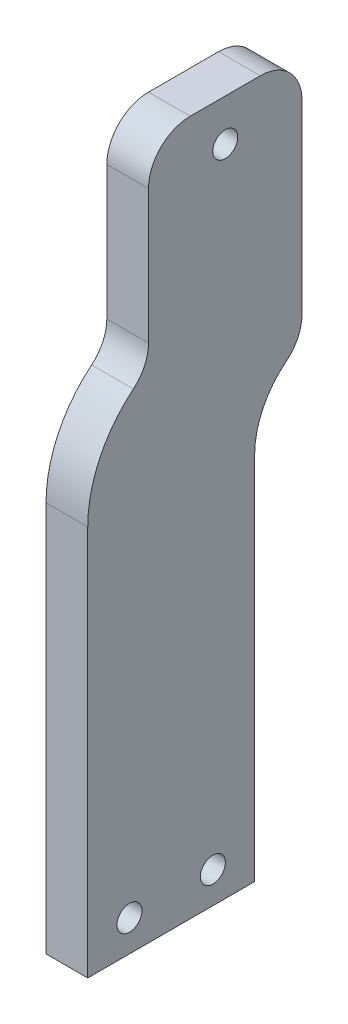
ISO-10303-21;
HEADER;
FILE_DESCRIPTION(('STEP AP214'),'2;1');
FILE_NAME('part.step','',(''),(''),'','','');
FILE_SCHEMA(('AUTOMOTIVE_DESIGN { 1 0 10303 214 1 1 1 1 }'));
ENDSEC;
DATA;
#1=APPLICATION_CONTEXT('core data for automotive mechanical design processes');
#2=APPLICATION_PROTOCOL_DEFINITION('international standard','automotive_design',2000,#1);
#3=PRODUCT_CONTEXT('',#1,'mechanical');
#4=PRODUCT('Part','Part','',(#3));
#5=PRODUCT_RELATED_PRODUCT_CATEGORY('part','',(#4));
#6=PRODUCT_DEFINITION_FORMATION('','',#4);
#7=PRODUCT_DEFINITION_CONTEXT('part definition',#1,'design');
#8=PRODUCT_DEFINITION('design','',#6,#7);
#9=PRODUCT_DEFINITION_SHAPE('','',#8);
#10=(LENGTH_UNIT() NAMED_UNIT(*) SI_UNIT(.MILLI.,.METRE.));
#11=(NAMED_UNIT(*) PLANE_ANGLE_UNIT() SI_UNIT($,.RADIAN.));
#12=(NAMED_UNIT(*) SI_UNIT($,.STERADIAN.) SOLID_ANGLE_UNIT());
#13=UNCERTAINTY_MEASURE_WITH_UNIT(LENGTH_MEASURE(1.E-05),#10,'distance_accuracy_value','');
#14=(GEOMETRIC_REPRESENTATION_CONTEXT(3) GLOBAL_UNCERTAINTY_ASSIGNED_CONTEXT((#13)) GLOBAL_UNIT_ASSIGNED_CONTEXT((#10,
#11,#12)) REPRESENTATION_CONTEXT('',''));
#15=CARTESIAN_POINT('',(0.,0.,0.));
#16=DIRECTION('',(0.,0.,1.));
#17=DIRECTION('',(1.,0.,0.));
#18=AXIS2_PLACEMENT_3D('',#15,#16,#17);
#19=CARTESIAN_POINT('',(10.,58.3956146638437,-40.0000999096368));
#20=DIRECTION('',(-1.,0.,0.));
#21=DIRECTION('',(0.,0.,1.));
#22=AXIS2_PLACEMENT_3D('',#19,#20,#21);
#23=CYLINDRICAL_SURFACE('',#22,20.);
#24=CARTESIAN_POINT('',(0.,58.3956146638437,-40.0000999096368));
#25=DIRECTION('',(-1.,0.,0.));
#26=DIRECTION('',(0.,0.,1.));
#27=AXIS2_PLACEMENT_3D('',#24,#25,#26);
#28=CIRCLE('',#27,20.);
#29=CARTESIAN_POINT('',(0.,58.3956146638437,-20.0000999096368));
#30=VERTEX_POINT('',#29);
#31=CARTESIAN_POINT('',(0.,74.0632893384125,-27.5693328258292));
#32=VERTEX_POINT('',#31);
#33=EDGE_CURVE('E151',#30,#32,#28,.T.);
#34=ORIENTED_EDGE('',*,*,#33,.T.);
#35=DIRECTION('',(-1.,0.,0.));
#36=VECTOR('',#35,1.);
#37=CARTESIAN_POINT('',(10.,74.0632893384125,-27.5693328258292));
#38=LINE('',#37,#36);
#39=CARTESIAN_POINT('',(10.,74.0632893384125,-27.5693328258292));
#40=VERTEX_POINT('',#39);
#41=EDGE_CURVE('E11',#40,#32,#38,.T.);
#42=ORIENTED_EDGE('',*,*,#41,.F.);
#43=CARTESIAN_POINT('',(10.,58.3956146638437,-40.0000999096368));
#44=DIRECTION('',(-1.,0.,0.));
#45=DIRECTION('',(0.,0.,1.));
#46=AXIS2_PLACEMENT_3D('',#43,#44,#45);
#47=CIRCLE('',#46,20.);
#48=CARTESIAN_POINT('',(10.,58.3956146638437,-20.0000999096368));
#49=VERTEX_POINT('',#48);
#50=EDGE_CURVE('E174',#49,#40,#47,.T.);
#51=ORIENTED_EDGE('',*,*,#50,.F.);
#52=DIRECTION('',(-1.,0.,0.));
#53=VECTOR('',#52,1.);
#54=CARTESIAN_POINT('',(10.,58.3956146638437,-20.0000999096368));
#55=LINE('',#54,#53);
#56=EDGE_CURVE('E147',#49,#30,#55,.T.);
#57=ORIENTED_EDGE('',*,*,#56,.T.);
#58=EDGE_LOOP('',(#34,#42,#51,#57));
#59=FACE_BOUND('',#58,.T.);
#60=ADVANCED_FACE('F31',(#59),#23,.F.);
#61=CARTESIAN_POINT('',(10.,81.8971266756969,-21.3539492839254));
#62=DIRECTION('',(-1.,0.,0.));
#63=DIRECTION('',(0.,0.,1.));
#64=AXIS2_PLACEMENT_3D('',#61,#62,#63);
#65=CYLINDRICAL_SURFACE('',#64,10.);
#66=CARTESIAN_POINT('',(0.,81.8971266756969,-21.3539492839254));
#67=DIRECTION('',(1.,0.,0.));
#68=DIRECTION('',(0.,0.,-1.));
#69=AXIS2_PLACEMENT_3D('',#66,#67,#68);
#70=CIRCLE('',#69,10.);
#71=CARTESIAN_POINT('',(0.,81.8971266756969,-31.3539492839254));
#72=VERTEX_POINT('',#71);
#73=EDGE_CURVE('E154',#32,#72,#70,.T.);
#74=ORIENTED_EDGE('',*,*,#73,.T.);
#75=DIRECTION('',(-1.,0.,0.));
#76=VECTOR('',#75,1.);
#77=CARTESIAN_POINT('',(10.,81.8971266756969,-31.3539492839254));
#78=LINE('',#77,#76);
#79=CARTESIAN_POINT('',(10.,81.8971266756969,-31.3539492839254));
#80=VERTEX_POINT('',#79);
#81=EDGE_CURVE('E39',#80,#72,#78,.T.);
#82=ORIENTED_EDGE('',*,*,#81,.F.);
#83=CARTESIAN_POINT('',(10.,81.8971266756969,-21.3539492839254));
#84=DIRECTION('',(1.,0.,0.));
#85=DIRECTION('',(0.,0.,-1.));
#86=AXIS2_PLACEMENT_3D('',#83,#84,#85);
#87=CIRCLE('',#86,10.);
#88=EDGE_CURVE('E102',#40,#80,#87,.T.);
#89=ORIENTED_EDGE('',*,*,#88,.F.);
#90=ORIENTED_EDGE('',*,*,#41,.T.);
#91=EDGE_LOOP('',(#74,#82,#89,#90));
#92=FACE_BOUND('',#91,.T.);
#93=ADVANCED_FACE('F253',(#92),#65,.T.);
#94=CARTESIAN_POINT('',(10.,126.453197443825,-31.3539492839253));
#95=DIRECTION('',(0.,0.,1.));
#96=DIRECTION('',(0.,-1.,0.));
#97=AXIS2_PLACEMENT_3D('',#94,#95,#96);
#98=PLANE('',#97);
#99=DIRECTION('',(0.,1.,0.));
#100=VECTOR('',#99,1.);
#101=CARTESIAN_POINT('',(0.,126.453197443825,-31.3539492839253));
#102=LINE('',#101,#100);
#103=CARTESIAN_POINT('',(0.,126.453197443825,-31.3539492839253));
#104=VERTEX_POINT('',#103);
#105=EDGE_CURVE('E157',#72,#104,#102,.T.);
#106=ORIENTED_EDGE('',*,*,#105,.T.);
#107=DIRECTION('',(-1.,0.,0.));
#108=VECTOR('',#107,1.);
#109=CARTESIAN_POINT('',(10.,126.453197443825,-31.3539492839253));
#110=LINE('',#109,#108);
#111=CARTESIAN_POINT('',(10.,126.453197443825,-31.3539492839253));
#112=VERTEX_POINT('',#111);
#113=EDGE_CURVE('E193',#112,#104,#110,.T.);
#114=ORIENTED_EDGE('',*,*,#113,.F.);
#115=DIRECTION('',(0.,1.,0.));
#116=VECTOR('',#115,1.);
#117=CARTESIAN_POINT('',(10.,126.453197443825,-31.3539492839253));
#118=LINE('',#117,#116);
#119=EDGE_CURVE('E201',#80,#112,#118,.T.);
#120=ORIENTED_EDGE('',*,*,#119,.F.);
#121=ORIENTED_EDGE('',*,*,#81,.T.);
#122=EDGE_LOOP('',(#106,#114,#120,#121));
#123=FACE_BOUND('',#122,.T.);
#124=ADVANCED_FACE('F199',(#123),#98,.F.);
#125=CARTESIAN_POINT('',(10.,126.453197443825,-21.3539492839253));
#126=DIRECTION('',(-1.,0.,0.));
#127=DIRECTION('',(0.,0.,1.));
#128=AXIS2_PLACEMENT_3D('',#125,#126,#127);
#129=CYLINDRICAL_SURFACE('',#128,10.);
#130=CARTESIAN_POINT('',(0.,126.453197443825,-21.3539492839253));
#131=DIRECTION('',(1.,0.,0.));
#132=DIRECTION('',(0.,0.,-1.));
#133=AXIS2_PLACEMENT_3D('',#130,#131,#132);
#134=CIRCLE('',#133,10.);
#135=CARTESIAN_POINT('',(0.,136.453197443825,-21.3539492839253));
#136=VERTEX_POINT('',#135);
#137=EDGE_CURVE('E159',#104,#136,#134,.T.);
#138=ORIENTED_EDGE('',*,*,#137,.T.);
#139=DIRECTION('',(-1.,0.,0.));
#140=VECTOR('',#139,1.);
#141=CARTESIAN_POINT('',(10.,136.453197443825,-21.3539492839253));
#142=LINE('',#141,#140);
#143=CARTESIAN_POINT('',(10.,136.453197443825,-21.3539492839253));
#144=VERTEX_POINT('',#143);
#145=EDGE_CURVE('E190',#144,#136,#142,.T.);
#146=ORIENTED_EDGE('',*,*,#145,.F.);
#147=CARTESIAN_POINT('',(10.,126.453197443825,-21.3539492839253));
#148=DIRECTION('',(1.,0.,0.));
#149=DIRECTION('',(0.,0.,-1.));
#150=AXIS2_PLACEMENT_3D('',#147,#148,#149);
#151=CIRCLE('',#150,10.);
#152=EDGE_CURVE('E219',#112,#144,#151,.T.);
#153=ORIENTED_EDGE('',*,*,#152,.F.);
#154=ORIENTED_EDGE('',*,*,#113,.T.);
#155=EDGE_LOOP('',(#138,#146,#153,#154));
#156=FACE_BOUND('',#155,.T.);
#157=ADVANCED_FACE('F210',(#156),#129,.T.);
#158=CARTESIAN_POINT('',(10.,136.453197443825,-4.56930347639573));
#159=DIRECTION('',(0.,-1.,0.));
#160=DIRECTION('',(0.,0.,-1.));
#161=AXIS2_PLACEMENT_3D('',#158,#159,#160);
#162=PLANE('',#161);
#163=DIRECTION('',(0.,0.,1.));
#164=VECTOR('',#163,1.);
#165=CARTESIAN_POINT('',(0.,136.453197443825,-4.56930347639573));
#166=LINE('',#165,#164);
#167=CARTESIAN_POINT('',(0.,136.453197443825,-4.56930347639573));
#168=VERTEX_POINT('',#167);
#169=EDGE_CURVE('E161',#136,#168,#166,.T.);
#170=ORIENTED_EDGE('',*,*,#169,.T.);
#171=DIRECTION('',(-1.,0.,0.));
#172=VECTOR('',#171,1.);
#173=CARTESIAN_POINT('',(10.,136.453197443825,-4.56930347639573));
#174=LINE('',#173,#172);
#175=CARTESIAN_POINT('',(10.,136.453197443825,-4.56930347639573));
#176=VERTEX_POINT('',#175);
#177=EDGE_CURVE('E187',#176,#168,#174,.T.);
#178=ORIENTED_EDGE('',*,*,#177,.F.);
#179=DIRECTION('',(0.,0.,1.));
#180=VECTOR('',#179,1.);
#181=CARTESIAN_POINT('',(10.,136.453197443825,-4.56930347639573));
#182=LINE('',#181,#180);
#183=EDGE_CURVE('E216',#144,#176,#182,.T.);
#184=ORIENTED_EDGE('',*,*,#183,.F.);
#185=ORIENTED_EDGE('',*,*,#145,.T.);
#186=EDGE_LOOP('',(#170,#178,#184,#185));
#187=FACE_BOUND('',#186,.T.);
#188=ADVANCED_FACE('F214',(#187),#162,.F.);
#189=CARTESIAN_POINT('',(10.,126.453197443825,-4.56930347639573));
#190=DIRECTION('',(-1.,0.,0.));
#191=DIRECTION('',(0.,0.,1.));
#192=AXIS2_PLACEMENT_3D('',#189,#190,#191);
#193=CYLINDRICAL_SURFACE('',#192,10.);
#194=CARTESIAN_POINT('',(0.,126.453197443825,-4.56930347639573));
#195=DIRECTION('',(1.,0.,0.));
#196=DIRECTION('',(0.,0.,1.));
#197=AXIS2_PLACEMENT_3D('',#194,#195,#196);
#198=CIRCLE('',#197,10.);
#199=CARTESIAN_POINT('',(0.,126.453197443825,5.43069652360427));
#200=VERTEX_POINT('',#199);
#201=EDGE_CURVE('E163',#168,#200,#198,.T.);
#202=ORIENTED_EDGE('',*,*,#201,.T.);
#203=DIRECTION('',(-1.,0.,0.));
#204=VECTOR('',#203,1.);
#205=CARTESIAN_POINT('',(10.,126.453197443825,5.43069652360427));
#206=LINE('',#205,#204);
#207=CARTESIAN_POINT('',(10.,126.453197443825,5.43069652360427));
#208=VERTEX_POINT('',#207);
#209=EDGE_CURVE('E184',#208,#200,#206,.T.);
#210=ORIENTED_EDGE('',*,*,#209,.F.);
#211=CARTESIAN_POINT('',(10.,126.453197443825,-4.56930347639573));
#212=DIRECTION('',(1.,0.,0.));
#213=DIRECTION('',(0.,0.,1.));
#214=AXIS2_PLACEMENT_3D('',#211,#212,#213);
#215=CIRCLE('',#214,10.);
#216=EDGE_CURVE('E218',#176,#208,#215,.T.);
#217=ORIENTED_EDGE('',*,*,#216,.F.);
#218=ORIENTED_EDGE('',*,*,#177,.T.);
#219=EDGE_LOOP('',(#202,#210,#217,#218));
#220=FACE_BOUND('',#219,.T.);
#221=ADVANCED_FACE('F266',(#220),#193,.T.);
#222=CARTESIAN_POINT('',(10.,94.3588410134998,5.43069652360427));
#223=DIRECTION('',(0.,0.,-1.));
#224=DIRECTION('',(-1.,0.,0.));
#225=AXIS2_PLACEMENT_3D('',#222,#223,#224);
#226=PLANE('',#225);
#227=DIRECTION('',(0.,-1.,0.));
#228=VECTOR('',#227,1.);
#229=CARTESIAN_POINT('',(0.,94.3588410134998,5.43069652360427));
#230=LINE('',#229,#228);
#231=CARTESIAN_POINT('',(0.,94.3588410134998,5.43069652360427));
#232=VERTEX_POINT('',#231);
#233=EDGE_CURVE('E165',#200,#232,#230,.T.);
#234=ORIENTED_EDGE('',*,*,#233,.T.);
#235=DIRECTION('',(-1.,0.,0.));
#236=VECTOR('',#235,1.);
#237=CARTESIAN_POINT('',(10.,94.3588410134998,5.43069652360427));
#238=LINE('',#237,#236);
#239=CARTESIAN_POINT('',(10.,94.3588410134998,5.43069652360427));
#240=VERTEX_POINT('',#239);
#241=EDGE_CURVE('E181',#240,#232,#238,.T.);
#242=ORIENTED_EDGE('',*,*,#241,.F.);
#243=DIRECTION('',(0.,-1.,0.));
#244=VECTOR('',#243,1.);
#245=CARTESIAN_POINT('',(10.,94.3588410134998,5.43069652360427));
#246=LINE('',#245,#244);
#247=EDGE_CURVE('E221',#208,#240,#246,.T.);
#248=ORIENTED_EDGE('',*,*,#247,.F.);
#249=ORIENTED_EDGE('',*,*,#209,.T.);
#250=EDGE_LOOP('',(#234,#242,#248,#249));
#251=FACE_BOUND('',#250,.T.);
#252=ADVANCED_FACE('F269',(#251),#226,.F.);
#253=CARTESIAN_POINT('',(10.,94.3588410134998,15.4306965236043));
#254=DIRECTION('',(-1.,0.,0.));
#255=DIRECTION('',(0.,0.,1.));
#256=AXIS2_PLACEMENT_3D('',#253,#254,#255);
#257=CYLINDRICAL_SURFACE('',#256,10.);
#258=CARTESIAN_POINT('',(0.,94.3588410134998,15.4306965236043));
#259=DIRECTION('',(-1.,0.,0.));
#260=DIRECTION('',(0.,0.,-1.));
#261=AXIS2_PLACEMENT_3D('',#258,#259,#260);
#262=CIRCLE('',#261,10.);
#263=CARTESIAN_POINT('',(0.,86.6400547068198,9.072997415294));
#264=VERTEX_POINT('',#263);
#265=EDGE_CURVE('E167',#232,#264,#262,.T.);
#266=ORIENTED_EDGE('',*,*,#265,.T.);
#267=DIRECTION('',(-1.,0.,0.));
#268=VECTOR('',#267,1.);
#269=CARTESIAN_POINT('',(10.,86.6400547068198,9.072997415294));
#270=LINE('',#269,#268);
#271=CARTESIAN_POINT('',(10.,86.6400547068198,9.072997415294));
#272=VERTEX_POINT('',#271);
#273=EDGE_CURVE('E178',#272,#264,#270,.T.);
#274=ORIENTED_EDGE('',*,*,#273,.F.);
#275=CARTESIAN_POINT('',(10.,94.3588410134998,15.4306965236043));
#276=DIRECTION('',(-1.,0.,0.));
#277=DIRECTION('',(0.,0.,-1.));
#278=AXIS2_PLACEMENT_3D('',#275,#276,#277);
#279=CIRCLE('',#278,10.);
#280=EDGE_CURVE('E227',#240,#272,#279,.T.);
#281=ORIENTED_EDGE('',*,*,#280,.F.);
#282=ORIENTED_EDGE('',*,*,#241,.T.);
#283=EDGE_LOOP('',(#266,#274,#281,#282));
#284=FACE_BOUND('',#283,.T.);
#285=ADVANCED_FACE('F233',(#284),#257,.F.);
#286=CARTESIAN_POINT('',(10.,63.4836957867797,-10.0000999096368));
#287=DIRECTION('',(-1.,0.,0.));
#288=DIRECTION('',(0.,0.,1.));
#289=AXIS2_PLACEMENT_3D('',#286,#287,#288);
#290=CYLINDRICAL_SURFACE('',#289,30.);
#291=CARTESIAN_POINT('',(0.,63.4836957867797,-10.0000999096368));
#292=DIRECTION('',(1.,0.,0.));
#293=DIRECTION('',(0.,0.,1.));
#294=AXIS2_PLACEMENT_3D('',#291,#292,#293);
#295=CIRCLE('',#294,30.);
#296=CARTESIAN_POINT('',(0.,63.4836957867797,19.9999000903632));
#297=VERTEX_POINT('',#296);
#298=EDGE_CURVE('E169',#264,#297,#295,.T.);
#299=ORIENTED_EDGE('',*,*,#298,.T.);
#300=DIRECTION('',(-1.,0.,0.));
#301=VECTOR('',#300,1.);
#302=CARTESIAN_POINT('',(10.,63.4836957867797,19.9999000903632));
#303=LINE('',#302,#301);
#304=CARTESIAN_POINT('',(10.,63.4836957867797,19.9999000903632));
#305=VERTEX_POINT('',#304);
#306=EDGE_CURVE('E142',#305,#297,#303,.T.);
#307=ORIENTED_EDGE('',*,*,#306,.F.);
#308=CARTESIAN_POINT('',(10.,63.4836957867797,-10.0000999096368));
#309=DIRECTION('',(1.,0.,0.));
#310=DIRECTION('',(0.,0.,1.));
#311=AXIS2_PLACEMENT_3D('',#308,#309,#310);
#312=CIRCLE('',#311,30.);
#313=EDGE_CURVE('E133',#272,#305,#312,.T.);
#314=ORIENTED_EDGE('',*,*,#313,.F.);
#315=ORIENTED_EDGE('',*,*,#273,.T.);
#316=EDGE_LOOP('',(#299,#307,#314,#315));
#317=FACE_BOUND('',#316,.T.);
#318=ADVANCED_FACE('F237',(#317),#290,.T.);
#319=CARTESIAN_POINT('',(10.,63.4836957867797,19.9999000903632));
#320=DIRECTION('',(0.,0.,-1.));
#321=DIRECTION('',(0.,1.,0.));
#322=AXIS2_PLACEMENT_3D('',#319,#320,#321);
#323=PLANE('',#322);
#324=DIRECTION('',(0.,-1.,0.));
#325=VECTOR('',#324,1.);
#326=CARTESIAN_POINT('',(0.,63.4836957867797,19.9999000903632));
#327=LINE('',#326,#325);
#328=CARTESIAN_POINT('',(0.,-30.1438635348826,19.9999000903632));
#329=VERTEX_POINT('',#328);
#330=EDGE_CURVE('E141',#297,#329,#327,.T.);
#331=ORIENTED_EDGE('',*,*,#330,.T.);
#332=DIRECTION('',(-1.,0.,0.));
#333=VECTOR('',#332,1.);
#334=CARTESIAN_POINT('',(10.,-30.1438635348826,19.9999000903632));
#335=LINE('',#334,#333);
#336=CARTESIAN_POINT('',(10.,-30.1438635348826,19.9999000903632));
#337=VERTEX_POINT('',#336);
#338=EDGE_CURVE('E138',#337,#329,#335,.T.);
#339=ORIENTED_EDGE('',*,*,#338,.F.);
#340=DIRECTION('',(0.,-1.,0.));
#341=VECTOR('',#340,1.);
#342=CARTESIAN_POINT('',(10.,63.4836957867797,19.9999000903632));
#343=LINE('',#342,#341);
#344=EDGE_CURVE('E127',#305,#337,#343,.T.);
#345=ORIENTED_EDGE('',*,*,#344,.F.);
#346=ORIENTED_EDGE('',*,*,#306,.T.);
#347=EDGE_LOOP('',(#331,#339,#345,#346));
#348=FACE_BOUND('',#347,.T.);
#349=ADVANCED_FACE('F139',(#348),#323,.F.);
#350=CARTESIAN_POINT('',(10.,-30.1438635348826,19.9999000903632));
#351=DIRECTION('',(0.,1.,0.));
#352=DIRECTION('',(0.,0.,1.));
#353=AXIS2_PLACEMENT_3D('',#350,#351,#352);
#354=PLANE('',#353);
#355=DIRECTION('',(0.,0.,-1.));
#356=VECTOR('',#355,1.);
#357=CARTESIAN_POINT('',(0.,-30.1438635348826,19.9999000903632));
#358=LINE('',#357,#356);
#359=CARTESIAN_POINT('',(0.,-30.1438635348826,-20.0000999096368));
#360=VERTEX_POINT('',#359);
#361=EDGE_CURVE('E88',#329,#360,#358,.T.);
#362=ORIENTED_EDGE('',*,*,#361,.T.);
#363=DIRECTION('',(-1.,0.,0.));
#364=VECTOR('',#363,1.);
#365=CARTESIAN_POINT('',(10.,-30.1438635348826,-20.0000999096368));
#366=LINE('',#365,#364);
#367=CARTESIAN_POINT('',(10.,-30.1438635348826,-20.0000999096368));
#368=VERTEX_POINT('',#367);
#369=EDGE_CURVE('E143',#368,#360,#366,.T.);
#370=ORIENTED_EDGE('',*,*,#369,.F.);
#371=DIRECTION('',(0.,0.,-1.));
#372=VECTOR('',#371,1.);
#373=CARTESIAN_POINT('',(10.,-30.1438635348826,19.9999000903632));
#374=LINE('',#373,#372);
#375=EDGE_CURVE('E131',#337,#368,#374,.T.);
#376=ORIENTED_EDGE('',*,*,#375,.F.);
#377=ORIENTED_EDGE('',*,*,#338,.T.);
#378=EDGE_LOOP('',(#362,#370,#376,#377));
#379=FACE_BOUND('',#378,.T.);
#380=ADVANCED_FACE('F145',(#379),#354,.F.);
#381=CARTESIAN_POINT('',(10.,58.3956146638437,-20.0000999096368));
#382=DIRECTION('',(0.,0.,1.));
#383=DIRECTION('',(0.,-1.,0.));
#384=AXIS2_PLACEMENT_3D('',#381,#382,#383);
#385=PLANE('',#384);
#386=DIRECTION('',(0.,1.,0.));
#387=VECTOR('',#386,1.);
#388=CARTESIAN_POINT('',(0.,58.3956146638437,-20.0000999096368));
#389=LINE('',#388,#387);
#390=EDGE_CURVE('E94',#360,#30,#389,.T.);
#391=ORIENTED_EDGE('',*,*,#390,.T.);
#392=ORIENTED_EDGE('',*,*,#56,.F.);
#393=DIRECTION('',(0.,1.,0.));
#394=VECTOR('',#393,1.);
#395=CARTESIAN_POINT('',(10.,58.3956146638437,-20.0000999096368));
#396=LINE('',#395,#394);
#397=EDGE_CURVE('E47',#368,#49,#396,.T.);
#398=ORIENTED_EDGE('',*,*,#397,.F.);
#399=ORIENTED_EDGE('',*,*,#369,.T.);
#400=EDGE_LOOP('',(#391,#392,#398,#399));
#401=FACE_BOUND('',#400,.T.);
#402=ADVANCED_FACE('F241',(#401),#385,.F.);
#403=CARTESIAN_POINT('',(10.,58.3956146638437,-40.0000999096368));
#404=DIRECTION('',(-1.,0.,0.));
#405=DIRECTION('',(0.,0.,1.));
#406=AXIS2_PLACEMENT_3D('',#403,#404,#405);
#407=PLANE('',#406);
#408=CARTESIAN_POINT('',(10.,-22.6438635348826,-9.99999999950687));
#409=DIRECTION('',(-1.,0.,0.));
#410=DIRECTION('',(0.,0.,1.));
#411=AXIS2_PLACEMENT_3D('',#408,#409,#410);
#412=CIRCLE('',#411,3.);
#413=CARTESIAN_POINT('',(10.,-22.6438635348826,-6.99999999950687));
#414=VERTEX_POINT('',#413);
#415=EDGE_CURVE('E345',#414,#414,#412,.T.);
#416=ORIENTED_EDGE('',*,*,#415,.T.);
#417=EDGE_LOOP('',(#416));
#418=FACE_BOUND('',#417,.T.);
#419=CARTESIAN_POINT('',(10.,126.453197443825,-12.9616263801605));
#420=DIRECTION('',(-1.,0.,0.));
#421=DIRECTION('',(0.,0.,1.));
#422=AXIS2_PLACEMENT_3D('',#419,#420,#421);
#423=CIRCLE('',#422,3.);
#424=CARTESIAN_POINT('',(10.,126.453197443825,-9.96162638016054));
#425=VERTEX_POINT('',#424);
#426=EDGE_CURVE('E349',#425,#425,#423,.T.);
#427=ORIENTED_EDGE('',*,*,#426,.T.);
#428=EDGE_LOOP('',(#427));
#429=FACE_BOUND('',#428,.T.);
#430=CARTESIAN_POINT('',(10.,-22.6438635348826,10.0000000004941));
#431=DIRECTION('',(-1.,0.,0.));
#432=DIRECTION('',(0.,0.,1.));
#433=AXIS2_PLACEMENT_3D('',#430,#431,#432);
#434=CIRCLE('',#433,3.00000000000002);
#435=CARTESIAN_POINT('',(10.,-22.6438635348826,13.0000000004941));
#436=VERTEX_POINT('',#435);
#437=EDGE_CURVE('E155',#436,#436,#434,.T.);
#438=ORIENTED_EDGE('',*,*,#437,.T.);
#439=EDGE_LOOP('',(#438));
#440=FACE_BOUND('',#439,.T.);
#441=ORIENTED_EDGE('',*,*,#50,.T.);
#442=ORIENTED_EDGE('',*,*,#88,.T.);
#443=ORIENTED_EDGE('',*,*,#119,.T.);
#444=ORIENTED_EDGE('',*,*,#152,.T.);
#445=ORIENTED_EDGE('',*,*,#183,.T.);
#446=ORIENTED_EDGE('',*,*,#216,.T.);
#447=ORIENTED_EDGE('',*,*,#247,.T.);
#448=ORIENTED_EDGE('',*,*,#280,.T.);
#449=ORIENTED_EDGE('',*,*,#313,.T.);
#450=ORIENTED_EDGE('',*,*,#344,.T.);
#451=ORIENTED_EDGE('',*,*,#375,.T.);
#452=ORIENTED_EDGE('',*,*,#397,.T.);
#453=EDGE_LOOP('',(#441,#442,#443,#444,#445,#446,#447,#448,#449,#450,#451,#452));
#454=FACE_BOUND('',#453,.T.);
#455=ADVANCED_FACE('F129',(#418,#429,#440,#454),#407,.F.);
#456=CARTESIAN_POINT('',(0.,58.3956146638437,-40.0000999096368));
#457=DIRECTION('',(-1.,0.,0.));
#458=DIRECTION('',(0.,0.,1.));
#459=AXIS2_PLACEMENT_3D('',#456,#457,#458);
#460=PLANE('',#459);
#461=CARTESIAN_POINT('',(0.,-22.6438635348826,-9.99999999950687));
#462=DIRECTION('',(-1.,0.,0.));
#463=DIRECTION('',(0.,0.,-1.));
#464=AXIS2_PLACEMENT_3D('',#461,#462,#463);
#465=CIRCLE('',#464,3.);
#466=CARTESIAN_POINT('',(0.,-22.6438635348826,-12.9999999995069));
#467=VERTEX_POINT('',#466);
#468=EDGE_CURVE('E342',#467,#467,#465,.T.);
#469=ORIENTED_EDGE('',*,*,#468,.F.);
#470=EDGE_LOOP('',(#469));
#471=FACE_BOUND('',#470,.T.);
#472=CARTESIAN_POINT('',(0.,126.453197443825,-12.9616263801605));
#473=DIRECTION('',(-1.,0.,0.));
#474=DIRECTION('',(0.,0.,1.));
#475=AXIS2_PLACEMENT_3D('',#472,#473,#474);
#476=CIRCLE('',#475,3.);
#477=CARTESIAN_POINT('',(0.,126.453197443825,-9.96162638016054));
#478=VERTEX_POINT('',#477);
#479=EDGE_CURVE('E346',#478,#478,#476,.T.);
#480=ORIENTED_EDGE('',*,*,#479,.F.);
#481=EDGE_LOOP('',(#480));
#482=FACE_BOUND('',#481,.T.);
#483=CARTESIAN_POINT('',(0.,-22.6438635348826,10.0000000004941));
#484=DIRECTION('',(-1.,0.,0.));
#485=DIRECTION('',(0.,0.,1.));
#486=AXIS2_PLACEMENT_3D('',#483,#484,#485);
#487=CIRCLE('',#486,3.00000000000002);
#488=CARTESIAN_POINT('',(0.,-22.6438635348826,13.0000000004941));
#489=VERTEX_POINT('',#488);
#490=EDGE_CURVE('E355',#489,#489,#487,.T.);
#491=ORIENTED_EDGE('',*,*,#490,.F.);
#492=EDGE_LOOP('',(#491));
#493=FACE_BOUND('',#492,.T.);
#494=ORIENTED_EDGE('',*,*,#33,.F.);
#495=ORIENTED_EDGE('',*,*,#390,.F.);
#496=ORIENTED_EDGE('',*,*,#361,.F.);
#497=ORIENTED_EDGE('',*,*,#330,.F.);
#498=ORIENTED_EDGE('',*,*,#298,.F.);
#499=ORIENTED_EDGE('',*,*,#265,.F.);
#500=ORIENTED_EDGE('',*,*,#233,.F.);
#501=ORIENTED_EDGE('',*,*,#201,.F.);
#502=ORIENTED_EDGE('',*,*,#169,.F.);
#503=ORIENTED_EDGE('',*,*,#137,.F.);
#504=ORIENTED_EDGE('',*,*,#105,.F.);
#505=ORIENTED_EDGE('',*,*,#73,.F.);
#506=EDGE_LOOP('',(#494,#495,#496,#497,#498,#499,#500,#501,#502,#503,#504,#505));
#507=FACE_BOUND('',#506,.T.);
#508=ADVANCED_FACE('F205',(#471,#482,#493,#507),#460,.T.);
#509=CARTESIAN_POINT('',(25.,-22.6438635348826,10.0000000004941));
#510=DIRECTION('',(-1.,0.,0.));
#511=DIRECTION('',(0.,0.,1.));
#512=AXIS2_PLACEMENT_3D('',#509,#510,#511);
#513=CYLINDRICAL_SURFACE('',#512,3.00000000000002);
#514=ORIENTED_EDGE('',*,*,#490,.T.);
#515=EDGE_LOOP('',(#514));
#516=FACE_BOUND('',#515,.T.);
#517=ORIENTED_EDGE('',*,*,#437,.F.);
#518=EDGE_LOOP('',(#517));
#519=FACE_BOUND('',#518,.T.);
#520=ADVANCED_FACE('F306',(#516,#519),#513,.F.);
#521=CARTESIAN_POINT('',(25.,126.453197443825,-12.9616263801605));
#522=DIRECTION('',(-1.,0.,0.));
#523=DIRECTION('',(0.,0.,1.));
#524=AXIS2_PLACEMENT_3D('',#521,#522,#523);
#525=CYLINDRICAL_SURFACE('',#524,3.);
#526=ORIENTED_EDGE('',*,*,#479,.T.);
#527=EDGE_LOOP('',(#526));
#528=FACE_BOUND('',#527,.T.);
#529=ORIENTED_EDGE('',*,*,#426,.F.);
#530=EDGE_LOOP('',(#529));
#531=FACE_BOUND('',#530,.T.);
#532=ADVANCED_FACE('F315',(#528,#531),#525,.F.);
#533=CARTESIAN_POINT('',(25.,-22.6438635348826,-9.99999999950687));
#534=DIRECTION('',(-1.,0.,0.));
#535=DIRECTION('',(0.,0.,1.));
#536=AXIS2_PLACEMENT_3D('',#533,#534,#535);
#537=CYLINDRICAL_SURFACE('',#536,3.);
#538=ORIENTED_EDGE('',*,*,#468,.T.);
#539=EDGE_LOOP('',(#538));
#540=FACE_BOUND('',#539,.T.);
#541=ORIENTED_EDGE('',*,*,#415,.F.);
#542=EDGE_LOOP('',(#541));
#543=FACE_BOUND('',#542,.T.);
#544=ADVANCED_FACE('F325',(#540,#543),#537,.F.);
#545=CLOSED_SHELL('',(#60,#93,#124,#157,#188,#221,#252,#285,#318,#349,#380,#402,#455,#508,#520,
#532,#544));
#546=MANIFOLD_SOLID_BREP('B2',#545);
#547=ADVANCED_BREP_SHAPE_REPRESENTATION('',(#18,#546),#14);
#548=SHAPE_DEFINITION_REPRESENTATION(#9,#547);
ENDSEC;
END-ISO-10303-21;
